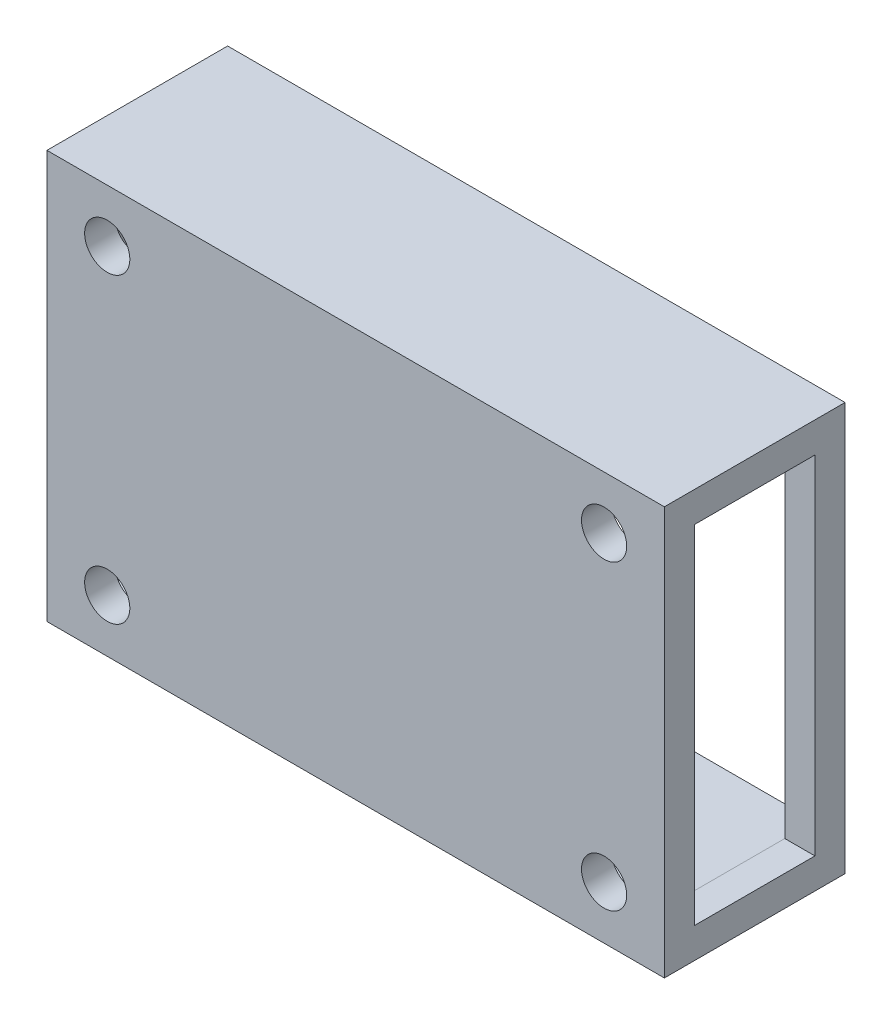
ISO-10303-21;
HEADER;
FILE_DESCRIPTION(('STEP AP214'),'2;1');
FILE_NAME('part.step','',(''),(''),'','','');
FILE_SCHEMA(('AUTOMOTIVE_DESIGN { 1 0 10303 214 1 1 1 1 }'));
ENDSEC;
DATA;
#1=APPLICATION_CONTEXT('core data for automotive mechanical design processes');
#2=APPLICATION_PROTOCOL_DEFINITION('international standard','automotive_design',2000,#1);
#3=PRODUCT_CONTEXT('',#1,'mechanical');
#4=PRODUCT('Part','Part','',(#3));
#5=PRODUCT_RELATED_PRODUCT_CATEGORY('part','',(#4));
#6=PRODUCT_DEFINITION_FORMATION('','',#4);
#7=PRODUCT_DEFINITION_CONTEXT('part definition',#1,'design');
#8=PRODUCT_DEFINITION('design','',#6,#7);
#9=PRODUCT_DEFINITION_SHAPE('','',#8);
#10=(LENGTH_UNIT() NAMED_UNIT(*) SI_UNIT(.MILLI.,.METRE.));
#11=(NAMED_UNIT(*) PLANE_ANGLE_UNIT() SI_UNIT($,.RADIAN.));
#12=(NAMED_UNIT(*) SI_UNIT($,.STERADIAN.) SOLID_ANGLE_UNIT());
#13=UNCERTAINTY_MEASURE_WITH_UNIT(LENGTH_MEASURE(1.E-05),#10,'distance_accuracy_value','');
#14=(GEOMETRIC_REPRESENTATION_CONTEXT(3) GLOBAL_UNCERTAINTY_ASSIGNED_CONTEXT((#13)) GLOBAL_UNIT_ASSIGNED_CONTEXT((#10,
#11,#12)) REPRESENTATION_CONTEXT('',''));
#15=CARTESIAN_POINT('',(0.,0.,0.));
#16=DIRECTION('',(0.,0.,1.));
#17=DIRECTION('',(1.,0.,0.));
#18=AXIS2_PLACEMENT_3D('',#15,#16,#17);
#19=CARTESIAN_POINT('',(2.,2.515,10.));
#20=DIRECTION('',(0.,0.,-1.));
#21=DIRECTION('',(-1.,0.,0.));
#22=AXIS2_PLACEMENT_3D('',#19,#20,#21);
#23=CYLINDRICAL_SURFACE('',#22,1.5);
#24=CARTESIAN_POINT('',(2.,2.515,2.));
#25=DIRECTION('',(0.,0.,-1.));
#26=DIRECTION('',(-1.,0.,0.));
#27=AXIS2_PLACEMENT_3D('',#24,#25,#26);
#28=CIRCLE('',#27,1.5);
#29=CARTESIAN_POINT('',(0.500000000000001,2.515,2.));
#30=VERTEX_POINT('',#29);
#31=EDGE_CURVE('E224',#30,#30,#28,.T.);
#32=ORIENTED_EDGE('',*,*,#31,.F.);
#33=EDGE_LOOP('',(#32));
#34=FACE_BOUND('',#33,.T.);
#35=CARTESIAN_POINT('',(2.,2.515,0.));
#36=DIRECTION('',(0.,0.,-1.));
#37=DIRECTION('',(-1.,0.,0.));
#38=AXIS2_PLACEMENT_3D('',#35,#36,#37);
#39=CIRCLE('',#38,1.5);
#40=CARTESIAN_POINT('',(2.,1.015,0.));
#41=VERTEX_POINT('',#40);
#42=EDGE_CURVE('E191',#41,#41,#39,.F.);
#43=ORIENTED_EDGE('',*,*,#42,.F.);
#44=EDGE_LOOP('',(#43));
#45=FACE_BOUND('',#44,.T.);
#46=ADVANCED_FACE('F34',(#34,#45),#23,.F.);
#47=CARTESIAN_POINT('',(2.,22.585,10.));
#48=DIRECTION('',(0.,0.,-1.));
#49=DIRECTION('',(-1.,0.,0.));
#50=AXIS2_PLACEMENT_3D('',#47,#48,#49);
#51=CYLINDRICAL_SURFACE('',#50,1.5);
#52=CARTESIAN_POINT('',(2.,22.585,2.));
#53=DIRECTION('',(0.,0.,-1.));
#54=DIRECTION('',(-1.,0.,0.));
#55=AXIS2_PLACEMENT_3D('',#52,#53,#54);
#56=CIRCLE('',#55,1.5);
#57=CARTESIAN_POINT('',(0.500000000000001,22.585,2.));
#58=VERTEX_POINT('',#57);
#59=EDGE_CURVE('E227',#58,#58,#56,.T.);
#60=ORIENTED_EDGE('',*,*,#59,.F.);
#61=EDGE_LOOP('',(#60));
#62=FACE_BOUND('',#61,.T.);
#63=CARTESIAN_POINT('',(2.,22.585,0.));
#64=DIRECTION('',(0.,0.,-1.));
#65=DIRECTION('',(-1.,0.,0.));
#66=AXIS2_PLACEMENT_3D('',#63,#64,#65);
#67=CIRCLE('',#66,1.5);
#68=CARTESIAN_POINT('',(2.,24.085,0.));
#69=VERTEX_POINT('',#68);
#70=EDGE_CURVE('E188',#69,#69,#67,.F.);
#71=ORIENTED_EDGE('',*,*,#70,.F.);
#72=EDGE_LOOP('',(#71));
#73=FACE_BOUND('',#72,.T.);
#74=ADVANCED_FACE('F268',(#62,#73),#51,.F.);
#75=CARTESIAN_POINT('',(34.9971426810003,2.515,5.));
#76=DIRECTION('',(0.,0.,-1.));
#77=DIRECTION('',(-1.,0.,0.));
#78=AXIS2_PLACEMENT_3D('',#75,#76,#77);
#79=CYLINDRICAL_SURFACE('',#78,1.5);
#80=CARTESIAN_POINT('',(34.9971426810003,2.515,2.));
#81=DIRECTION('',(0.,0.,-1.));
#82=DIRECTION('',(-1.,0.,0.));
#83=AXIS2_PLACEMENT_3D('',#80,#81,#82);
#84=CIRCLE('',#83,1.5);
#85=CARTESIAN_POINT('',(33.4971426810003,2.515,2.));
#86=VERTEX_POINT('',#85);
#87=EDGE_CURVE('E216',#86,#86,#84,.T.);
#88=ORIENTED_EDGE('',*,*,#87,.F.);
#89=EDGE_LOOP('',(#88));
#90=FACE_BOUND('',#89,.T.);
#91=CARTESIAN_POINT('',(34.9971426810003,2.515,0.));
#92=DIRECTION('',(0.,0.,-1.));
#93=DIRECTION('',(-1.,0.,0.));
#94=AXIS2_PLACEMENT_3D('',#91,#92,#93);
#95=CIRCLE('',#94,1.5);
#96=CARTESIAN_POINT('',(34.9971426810003,1.015,0.));
#97=VERTEX_POINT('',#96);
#98=EDGE_CURVE('E178',#97,#97,#95,.F.);
#99=ORIENTED_EDGE('',*,*,#98,.F.);
#100=EDGE_LOOP('',(#99));
#101=FACE_BOUND('',#100,.T.);
#102=ADVANCED_FACE('F265',(#90,#101),#79,.F.);
#103=CARTESIAN_POINT('',(34.9971426810003,22.585,5.));
#104=DIRECTION('',(0.,0.,-1.));
#105=DIRECTION('',(-1.,0.,0.));
#106=AXIS2_PLACEMENT_3D('',#103,#104,#105);
#107=CYLINDRICAL_SURFACE('',#106,1.5);
#108=CARTESIAN_POINT('',(34.9971426810003,22.585,2.));
#109=DIRECTION('',(0.,0.,-1.));
#110=DIRECTION('',(-1.,0.,0.));
#111=AXIS2_PLACEMENT_3D('',#108,#109,#110);
#112=CIRCLE('',#111,1.5);
#113=CARTESIAN_POINT('',(33.4971426810003,22.585,2.));
#114=VERTEX_POINT('',#113);
#115=EDGE_CURVE('E221',#114,#114,#112,.T.);
#116=ORIENTED_EDGE('',*,*,#115,.F.);
#117=EDGE_LOOP('',(#116));
#118=FACE_BOUND('',#117,.T.);
#119=CARTESIAN_POINT('',(34.9971426810003,22.585,0.));
#120=DIRECTION('',(0.,0.,-1.));
#121=DIRECTION('',(-1.,0.,0.));
#122=AXIS2_PLACEMENT_3D('',#119,#120,#121);
#123=CIRCLE('',#122,1.5);
#124=CARTESIAN_POINT('',(34.9971426810003,24.085,0.));
#125=VERTEX_POINT('',#124);
#126=EDGE_CURVE('E248',#125,#125,#123,.F.);
#127=ORIENTED_EDGE('',*,*,#126,.F.);
#128=EDGE_LOOP('',(#127));
#129=FACE_BOUND('',#128,.T.);
#130=ADVANCED_FACE('F267',(#118,#129),#107,.F.);
#131=CARTESIAN_POINT('',(0.,0.,2.));
#132=DIRECTION('',(0.,0.,-1.));
#133=DIRECTION('',(-1.,0.,0.));
#134=AXIS2_PLACEMENT_3D('',#131,#132,#133);
#135=PLANE('',#134);
#136=ORIENTED_EDGE('',*,*,#115,.T.);
#137=EDGE_LOOP('',(#136));
#138=FACE_BOUND('',#137,.T.);
#139=ORIENTED_EDGE('',*,*,#87,.T.);
#140=EDGE_LOOP('',(#139));
#141=FACE_BOUND('',#140,.T.);
#142=ORIENTED_EDGE('',*,*,#59,.T.);
#143=EDGE_LOOP('',(#142));
#144=FACE_BOUND('',#143,.T.);
#145=ORIENTED_EDGE('',*,*,#31,.T.);
#146=EDGE_LOOP('',(#145));
#147=FACE_BOUND('',#146,.T.);
#148=DIRECTION('',(0.,1.,0.));
#149=VECTOR('',#148,1.);
#150=CARTESIAN_POINT('',(39.,25.1,2.));
#151=LINE('',#150,#149);
#152=CARTESIAN_POINT('',(39.,-1.,2.));
#153=VERTEX_POINT('',#152);
#154=CARTESIAN_POINT('',(39.,26.1,2.));
#155=VERTEX_POINT('',#154);
#156=EDGE_CURVE('E244',#153,#155,#151,.T.);
#157=ORIENTED_EDGE('',*,*,#156,.T.);
#158=DIRECTION('',(1.,0.,0.));
#159=VECTOR('',#158,1.);
#160=CARTESIAN_POINT('',(39.,26.1,2.));
#161=LINE('',#160,#159);
#162=CARTESIAN_POINT('',(-2.00285731899973,26.1,2.));
#163=VERTEX_POINT('',#162);
#164=EDGE_CURVE('E207',#163,#155,#161,.T.);
#165=ORIENTED_EDGE('',*,*,#164,.F.);
#166=DIRECTION('',(0.,-1.,0.));
#167=VECTOR('',#166,1.);
#168=CARTESIAN_POINT('',(-2.00285731899973,25.1,2.));
#169=LINE('',#168,#167);
#170=CARTESIAN_POINT('',(-2.00285731899973,-1.,2.));
#171=VERTEX_POINT('',#170);
#172=EDGE_CURVE('E246',#163,#171,#169,.T.);
#173=ORIENTED_EDGE('',*,*,#172,.T.);
#174=DIRECTION('',(-1.,0.,0.));
#175=VECTOR('',#174,1.);
#176=CARTESIAN_POINT('',(-2.00285731899973,-1.,2.));
#177=LINE('',#176,#175);
#178=EDGE_CURVE('E195',#153,#171,#177,.T.);
#179=ORIENTED_EDGE('',*,*,#178,.F.);
#180=EDGE_LOOP('',(#157,#165,#173,#179));
#181=FACE_BOUND('',#180,.T.);
#182=ADVANCED_FACE('F275',(#138,#141,#144,#147,#181),#135,.F.);
#183=CARTESIAN_POINT('',(0.,0.,0.));
#184=DIRECTION('',(0.,0.,-1.));
#185=DIRECTION('',(-1.,0.,0.));
#186=AXIS2_PLACEMENT_3D('',#183,#184,#185);
#187=PLANE('',#186);
#188=ORIENTED_EDGE('',*,*,#126,.T.);
#189=DIRECTION('',(1.,0.,0.));
#190=VECTOR('',#189,1.);
#191=CARTESIAN_POINT('',(2.,24.085,0.));
#192=LINE('',#191,#190);
#193=CARTESIAN_POINT('',(36.9971426810003,24.085,0.));
#194=VERTEX_POINT('',#193);
#195=EDGE_CURVE('E166',#125,#194,#192,.T.);
#196=ORIENTED_EDGE('',*,*,#195,.T.);
#197=DIRECTION('',(0.,-1.,0.));
#198=VECTOR('',#197,1.);
#199=CARTESIAN_POINT('',(36.9971426810003,22.1,0.));
#200=LINE('',#199,#198);
#201=CARTESIAN_POINT('',(36.9971426810003,24.08,0.));
#202=VERTEX_POINT('',#201);
#203=EDGE_CURVE('E234',#194,#202,#200,.T.);
#204=ORIENTED_EDGE('',*,*,#203,.T.);
#205=DIRECTION('',(1.,0.,0.));
#206=VECTOR('',#205,1.);
#207=CARTESIAN_POINT('',(29.,24.08,0.));
#208=LINE('',#207,#206);
#209=CARTESIAN_POINT('',(39.,24.08,0.));
#210=VERTEX_POINT('',#209);
#211=EDGE_CURVE('E157',#202,#210,#208,.T.);
#212=ORIENTED_EDGE('',*,*,#211,.T.);
#213=DIRECTION('',(0.,-1.,0.));
#214=VECTOR('',#213,1.);
#215=CARTESIAN_POINT('',(39.,1.02,0.));
#216=LINE('',#215,#214);
#217=CARTESIAN_POINT('',(39.,1.02,0.));
#218=VERTEX_POINT('',#217);
#219=EDGE_CURVE('E49',#210,#218,#216,.T.);
#220=ORIENTED_EDGE('',*,*,#219,.T.);
#221=DIRECTION('',(1.,0.,0.));
#222=VECTOR('',#221,1.);
#223=CARTESIAN_POINT('',(29.,1.02,0.));
#224=LINE('',#223,#222);
#225=CARTESIAN_POINT('',(36.9971426810003,1.02,0.));
#226=VERTEX_POINT('',#225);
#227=EDGE_CURVE('E142',#226,#218,#224,.T.);
#228=ORIENTED_EDGE('',*,*,#227,.F.);
#229=CARTESIAN_POINT('',(36.9971426810003,1.015,0.));
#230=VERTEX_POINT('',#229);
#231=EDGE_CURVE('E238',#226,#230,#200,.T.);
#232=ORIENTED_EDGE('',*,*,#231,.T.);
#233=DIRECTION('',(-1.,0.,0.));
#234=VECTOR('',#233,1.);
#235=CARTESIAN_POINT('',(36.9971426810003,1.015,0.));
#236=LINE('',#235,#234);
#237=EDGE_CURVE('E167',#230,#97,#236,.T.);
#238=ORIENTED_EDGE('',*,*,#237,.T.);
#239=ORIENTED_EDGE('',*,*,#98,.T.);
#240=EDGE_CURVE('E171',#97,#41,#236,.T.);
#241=ORIENTED_EDGE('',*,*,#240,.T.);
#242=ORIENTED_EDGE('',*,*,#42,.T.);
#243=CARTESIAN_POINT('',(0.,1.015,0.));
#244=VERTEX_POINT('',#243);
#245=EDGE_CURVE('E164',#41,#244,#236,.T.);
#246=ORIENTED_EDGE('',*,*,#245,.T.);
#247=DIRECTION('',(0.,1.,0.));
#248=VECTOR('',#247,1.);
#249=CARTESIAN_POINT('',(0.,22.1,0.));
#250=LINE('',#249,#248);
#251=CARTESIAN_POINT('',(0.,24.085,0.));
#252=VERTEX_POINT('',#251);
#253=EDGE_CURVE('E230',#244,#252,#250,.T.);
#254=ORIENTED_EDGE('',*,*,#253,.T.);
#255=EDGE_CURVE('E162',#252,#69,#192,.T.);
#256=ORIENTED_EDGE('',*,*,#255,.T.);
#257=ORIENTED_EDGE('',*,*,#70,.T.);
#258=EDGE_CURVE('E165',#69,#125,#192,.T.);
#259=ORIENTED_EDGE('',*,*,#258,.T.);
#260=EDGE_LOOP('',(#188,#196,#204,#212,#220,#228,#232,#238,#239,#241,#242,#246,#254,#256,#257,#259));
#261=FACE_BOUND('',#260,.T.);
#262=ADVANCED_FACE('F36',(#261),#187,.T.);
#263=CARTESIAN_POINT('',(-2.00285731899973,25.1,0.));
#264=DIRECTION('',(-1.,0.,0.));
#265=DIRECTION('',(0.,0.,1.));
#266=AXIS2_PLACEMENT_3D('',#263,#264,#265);
#267=PLANE('',#266);
#268=ORIENTED_EDGE('',*,*,#172,.F.);
#269=DIRECTION('',(0.,0.,-1.));
#270=VECTOR('',#269,1.);
#271=CARTESIAN_POINT('',(-2.00285731899973,26.1,2.));
#272=LINE('',#271,#270);
#273=CARTESIAN_POINT('',(-2.00285731899973,26.1,-10.));
#274=VERTEX_POINT('',#273);
#275=EDGE_CURVE('E210',#163,#274,#272,.T.);
#276=ORIENTED_EDGE('',*,*,#275,.T.);
#277=DIRECTION('',(0.,1.,0.));
#278=VECTOR('',#277,1.);
#279=CARTESIAN_POINT('',(-2.00285731899973,25.1,-10.));
#280=LINE('',#279,#278);
#281=CARTESIAN_POINT('',(-2.00285731899973,-1.,-10.));
#282=VERTEX_POINT('',#281);
#283=EDGE_CURVE('E242',#282,#274,#280,.T.);
#284=ORIENTED_EDGE('',*,*,#283,.F.);
#285=DIRECTION('',(0.,0.,-1.));
#286=VECTOR('',#285,1.);
#287=CARTESIAN_POINT('',(-2.00285731899973,-1.,2.));
#288=LINE('',#287,#286);
#289=EDGE_CURVE('E201',#171,#282,#288,.T.);
#290=ORIENTED_EDGE('',*,*,#289,.F.);
#291=EDGE_LOOP('',(#268,#276,#284,#290));
#292=FACE_BOUND('',#291,.T.);
#293=ADVANCED_FACE('F304',(#292),#267,.T.);
#294=CARTESIAN_POINT('',(39.,25.1,0.));
#295=DIRECTION('',(1.,0.,0.));
#296=DIRECTION('',(0.,0.,-1.));
#297=AXIS2_PLACEMENT_3D('',#294,#295,#296);
#298=PLANE('',#297);
#299=ORIENTED_EDGE('',*,*,#219,.F.);
#300=DIRECTION('',(0.,0.,1.));
#301=VECTOR('',#300,1.);
#302=CARTESIAN_POINT('',(39.,24.08,-8.00000000000001));
#303=LINE('',#302,#301);
#304=CARTESIAN_POINT('',(39.,24.08,-8.00000000000001));
#305=VERTEX_POINT('',#304);
#306=EDGE_CURVE('E152',#305,#210,#303,.T.);
#307=ORIENTED_EDGE('',*,*,#306,.F.);
#308=DIRECTION('',(0.,1.,0.));
#309=VECTOR('',#308,1.);
#310=CARTESIAN_POINT('',(39.,24.08,-8.00000000000001));
#311=LINE('',#310,#309);
#312=CARTESIAN_POINT('',(39.,1.02,-8.00000000000001));
#313=VERTEX_POINT('',#312);
#314=EDGE_CURVE('E137',#313,#305,#311,.T.);
#315=ORIENTED_EDGE('',*,*,#314,.F.);
#316=DIRECTION('',(0.,0.,-1.));
#317=VECTOR('',#316,1.);
#318=CARTESIAN_POINT('',(39.,1.02,-8.00000000000001));
#319=LINE('',#318,#317);
#320=EDGE_CURVE('E145',#218,#313,#319,.T.);
#321=ORIENTED_EDGE('',*,*,#320,.F.);
#322=EDGE_LOOP('',(#299,#307,#315,#321));
#323=FACE_BOUND('',#322,.T.);
#324=ORIENTED_EDGE('',*,*,#156,.F.);
#325=DIRECTION('',(0.,0.,-1.));
#326=VECTOR('',#325,1.);
#327=CARTESIAN_POINT('',(39.,-1.,2.));
#328=LINE('',#327,#326);
#329=CARTESIAN_POINT('',(39.,-1.,-10.));
#330=VERTEX_POINT('',#329);
#331=EDGE_CURVE('E198',#153,#330,#328,.T.);
#332=ORIENTED_EDGE('',*,*,#331,.T.);
#333=DIRECTION('',(0.,-1.,0.));
#334=VECTOR('',#333,1.);
#335=CARTESIAN_POINT('',(39.,0.,-10.));
#336=LINE('',#335,#334);
#337=CARTESIAN_POINT('',(39.,26.1,-10.));
#338=VERTEX_POINT('',#337);
#339=EDGE_CURVE('E236',#338,#330,#336,.T.);
#340=ORIENTED_EDGE('',*,*,#339,.F.);
#341=DIRECTION('',(0.,0.,-1.));
#342=VECTOR('',#341,1.);
#343=CARTESIAN_POINT('',(39.,26.1,2.));
#344=LINE('',#343,#342);
#345=EDGE_CURVE('E213',#155,#338,#344,.T.);
#346=ORIENTED_EDGE('',*,*,#345,.F.);
#347=EDGE_LOOP('',(#324,#332,#340,#346));
#348=FACE_BOUND('',#347,.T.);
#349=ADVANCED_FACE('F149',(#323,#348),#298,.T.);
#350=CARTESIAN_POINT('',(36.9971426810003,22.1,-10.));
#351=DIRECTION('',(-1.,0.,0.));
#352=DIRECTION('',(0.,0.,1.));
#353=AXIS2_PLACEMENT_3D('',#350,#351,#352);
#354=PLANE('',#353);
#355=DIRECTION('',(0.,0.,-1.));
#356=VECTOR('',#355,1.);
#357=CARTESIAN_POINT('',(36.9971426810003,24.08,-10.));
#358=LINE('',#357,#356);
#359=CARTESIAN_POINT('',(36.9971426810003,24.08,-8.00000000000001));
#360=VERTEX_POINT('',#359);
#361=EDGE_CURVE('E11',#202,#360,#358,.T.);
#362=ORIENTED_EDGE('',*,*,#361,.F.);
#363=ORIENTED_EDGE('',*,*,#203,.F.);
#364=DIRECTION('',(0.,0.,-1.));
#365=VECTOR('',#364,1.);
#366=CARTESIAN_POINT('',(36.9971426810003,24.085,0.));
#367=LINE('',#366,#365);
#368=CARTESIAN_POINT('',(36.9971426810003,24.085,-10.));
#369=VERTEX_POINT('',#368);
#370=EDGE_CURVE('E170',#194,#369,#367,.T.);
#371=ORIENTED_EDGE('',*,*,#370,.T.);
#372=DIRECTION('',(0.,-1.,0.));
#373=VECTOR('',#372,1.);
#374=CARTESIAN_POINT('',(36.9971426810003,22.1,-10.));
#375=LINE('',#374,#373);
#376=CARTESIAN_POINT('',(36.9971426810003,1.015,-10.));
#377=VERTEX_POINT('',#376);
#378=EDGE_CURVE('E233',#369,#377,#375,.T.);
#379=ORIENTED_EDGE('',*,*,#378,.T.);
#380=DIRECTION('',(0.,0.,-1.));
#381=VECTOR('',#380,1.);
#382=CARTESIAN_POINT('',(36.9971426810003,1.015,0.));
#383=LINE('',#382,#381);
#384=EDGE_CURVE('E182',#230,#377,#383,.T.);
#385=ORIENTED_EDGE('',*,*,#384,.F.);
#386=ORIENTED_EDGE('',*,*,#231,.F.);
#387=DIRECTION('',(0.,0.,1.));
#388=VECTOR('',#387,1.);
#389=CARTESIAN_POINT('',(36.9971426810003,1.02,-9.99999999999999));
#390=LINE('',#389,#388);
#391=CARTESIAN_POINT('',(36.9971426810003,1.02,-8.00000000000001));
#392=VERTEX_POINT('',#391);
#393=EDGE_CURVE('E250',#392,#226,#390,.T.);
#394=ORIENTED_EDGE('',*,*,#393,.F.);
#395=DIRECTION('',(0.,-1.,0.));
#396=VECTOR('',#395,1.);
#397=CARTESIAN_POINT('',(36.9971426810003,22.1,-8.00000000000001));
#398=LINE('',#397,#396);
#399=EDGE_CURVE('E42',#360,#392,#398,.T.);
#400=ORIENTED_EDGE('',*,*,#399,.F.);
#401=EDGE_LOOP('',(#362,#363,#371,#379,#385,#386,#394,#400));
#402=FACE_BOUND('',#401,.T.);
#403=ADVANCED_FACE('F255',(#402),#354,.T.);
#404=CARTESIAN_POINT('',(0.,22.1,-10.));
#405=DIRECTION('',(1.,0.,0.));
#406=DIRECTION('',(0.,0.,-1.));
#407=AXIS2_PLACEMENT_3D('',#404,#405,#406);
#408=PLANE('',#407);
#409=ORIENTED_EDGE('',*,*,#253,.F.);
#410=DIRECTION('',(0.,0.,-1.));
#411=VECTOR('',#410,1.);
#412=CARTESIAN_POINT('',(0.,1.015,0.));
#413=LINE('',#412,#411);
#414=CARTESIAN_POINT('',(0.,1.015,-10.));
#415=VERTEX_POINT('',#414);
#416=EDGE_CURVE('E179',#244,#415,#413,.T.);
#417=ORIENTED_EDGE('',*,*,#416,.T.);
#418=DIRECTION('',(0.,1.,0.));
#419=VECTOR('',#418,1.);
#420=CARTESIAN_POINT('',(0.,22.1,-10.));
#421=LINE('',#420,#419);
#422=CARTESIAN_POINT('',(0.,24.085,-10.));
#423=VERTEX_POINT('',#422);
#424=EDGE_CURVE('E231',#415,#423,#421,.T.);
#425=ORIENTED_EDGE('',*,*,#424,.T.);
#426=DIRECTION('',(0.,0.,-1.));
#427=VECTOR('',#426,1.);
#428=CARTESIAN_POINT('',(0.,24.085,0.));
#429=LINE('',#428,#427);
#430=EDGE_CURVE('E175',#252,#423,#429,.T.);
#431=ORIENTED_EDGE('',*,*,#430,.F.);
#432=EDGE_LOOP('',(#409,#417,#425,#431));
#433=FACE_BOUND('',#432,.T.);
#434=ADVANCED_FACE('F293',(#433),#408,.T.);
#435=CARTESIAN_POINT('',(0.,0.,-10.));
#436=DIRECTION('',(0.,0.,1.));
#437=DIRECTION('',(1.,0.,0.));
#438=AXIS2_PLACEMENT_3D('',#435,#436,#437);
#439=PLANE('',#438);
#440=ORIENTED_EDGE('',*,*,#424,.F.);
#441=DIRECTION('',(-1.,0.,0.));
#442=VECTOR('',#441,1.);
#443=CARTESIAN_POINT('',(2.,1.015,-10.));
#444=LINE('',#443,#442);
#445=EDGE_CURVE('E159',#377,#415,#444,.T.);
#446=ORIENTED_EDGE('',*,*,#445,.F.);
#447=ORIENTED_EDGE('',*,*,#378,.F.);
#448=DIRECTION('',(1.,0.,0.));
#449=VECTOR('',#448,1.);
#450=CARTESIAN_POINT('',(2.,24.085,-10.));
#451=LINE('',#450,#449);
#452=EDGE_CURVE('E173',#423,#369,#451,.T.);
#453=ORIENTED_EDGE('',*,*,#452,.F.);
#454=EDGE_LOOP('',(#440,#446,#447,#453));
#455=FACE_BOUND('',#454,.T.);
#456=ORIENTED_EDGE('',*,*,#339,.T.);
#457=DIRECTION('',(-1.,0.,0.));
#458=VECTOR('',#457,1.);
#459=CARTESIAN_POINT('',(-2.00285731899973,-1.,-10.));
#460=LINE('',#459,#458);
#461=EDGE_CURVE('E194',#330,#282,#460,.T.);
#462=ORIENTED_EDGE('',*,*,#461,.T.);
#463=ORIENTED_EDGE('',*,*,#283,.T.);
#464=DIRECTION('',(1.,0.,0.));
#465=VECTOR('',#464,1.);
#466=CARTESIAN_POINT('',(39.,26.1,-10.));
#467=LINE('',#466,#465);
#468=EDGE_CURVE('E204',#274,#338,#467,.T.);
#469=ORIENTED_EDGE('',*,*,#468,.T.);
#470=EDGE_LOOP('',(#456,#462,#463,#469));
#471=FACE_BOUND('',#470,.T.);
#472=ADVANCED_FACE('F296',(#455,#471),#439,.F.);
#473=CARTESIAN_POINT('',(39.,26.1,2.));
#474=DIRECTION('',(0.,1.,0.));
#475=DIRECTION('',(0.,0.,1.));
#476=AXIS2_PLACEMENT_3D('',#473,#474,#475);
#477=PLANE('',#476);
#478=ORIENTED_EDGE('',*,*,#468,.F.);
#479=ORIENTED_EDGE('',*,*,#275,.F.);
#480=ORIENTED_EDGE('',*,*,#164,.T.);
#481=ORIENTED_EDGE('',*,*,#345,.T.);
#482=EDGE_LOOP('',(#478,#479,#480,#481));
#483=FACE_BOUND('',#482,.T.);
#484=ADVANCED_FACE('F300',(#483),#477,.T.);
#485=CARTESIAN_POINT('',(-2.00285731899973,-1.,2.));
#486=DIRECTION('',(0.,-1.,0.));
#487=DIRECTION('',(0.,0.,-1.));
#488=AXIS2_PLACEMENT_3D('',#485,#486,#487);
#489=PLANE('',#488);
#490=ORIENTED_EDGE('',*,*,#461,.F.);
#491=ORIENTED_EDGE('',*,*,#331,.F.);
#492=ORIENTED_EDGE('',*,*,#178,.T.);
#493=ORIENTED_EDGE('',*,*,#289,.T.);
#494=EDGE_LOOP('',(#490,#491,#492,#493));
#495=FACE_BOUND('',#494,.T.);
#496=ADVANCED_FACE('F329',(#495),#489,.T.);
#497=CARTESIAN_POINT('',(2.,24.085,0.));
#498=DIRECTION('',(0.,1.,0.));
#499=DIRECTION('',(0.,0.,1.));
#500=AXIS2_PLACEMENT_3D('',#497,#498,#499);
#501=PLANE('',#500);
#502=ORIENTED_EDGE('',*,*,#452,.T.);
#503=ORIENTED_EDGE('',*,*,#370,.F.);
#504=ORIENTED_EDGE('',*,*,#195,.F.);
#505=ORIENTED_EDGE('',*,*,#258,.F.);
#506=ORIENTED_EDGE('',*,*,#255,.F.);
#507=ORIENTED_EDGE('',*,*,#430,.T.);
#508=EDGE_LOOP('',(#502,#503,#504,#505,#506,#507));
#509=FACE_BOUND('',#508,.T.);
#510=ADVANCED_FACE('F332',(#509),#501,.F.);
#511=CARTESIAN_POINT('',(2.,1.015,0.));
#512=DIRECTION('',(0.,-1.,0.));
#513=DIRECTION('',(0.,0.,-1.));
#514=AXIS2_PLACEMENT_3D('',#511,#512,#513);
#515=PLANE('',#514);
#516=ORIENTED_EDGE('',*,*,#445,.T.);
#517=ORIENTED_EDGE('',*,*,#416,.F.);
#518=ORIENTED_EDGE('',*,*,#245,.F.);
#519=ORIENTED_EDGE('',*,*,#240,.F.);
#520=ORIENTED_EDGE('',*,*,#237,.F.);
#521=ORIENTED_EDGE('',*,*,#384,.T.);
#522=EDGE_LOOP('',(#516,#517,#518,#519,#520,#521));
#523=FACE_BOUND('',#522,.T.);
#524=ADVANCED_FACE('F261',(#523),#515,.F.);
#525=CARTESIAN_POINT('',(29.,24.08,-8.00000000000001));
#526=DIRECTION('',(0.,1.,0.));
#527=DIRECTION('',(0.,0.,1.));
#528=AXIS2_PLACEMENT_3D('',#525,#526,#527);
#529=PLANE('',#528);
#530=ORIENTED_EDGE('',*,*,#361,.T.);
#531=DIRECTION('',(1.,0.,0.));
#532=VECTOR('',#531,1.);
#533=CARTESIAN_POINT('',(29.,24.08,-8.00000000000001));
#534=LINE('',#533,#532);
#535=EDGE_CURVE('E141',#360,#305,#534,.T.);
#536=ORIENTED_EDGE('',*,*,#535,.T.);
#537=ORIENTED_EDGE('',*,*,#306,.T.);
#538=ORIENTED_EDGE('',*,*,#211,.F.);
#539=EDGE_LOOP('',(#530,#536,#537,#538));
#540=FACE_BOUND('',#539,.T.);
#541=ADVANCED_FACE('F342',(#540),#529,.F.);
#542=CARTESIAN_POINT('',(29.,24.08,-8.00000000000001));
#543=DIRECTION('',(0.,0.,-1.));
#544=DIRECTION('',(-1.,0.,0.));
#545=AXIS2_PLACEMENT_3D('',#542,#543,#544);
#546=PLANE('',#545);
#547=ORIENTED_EDGE('',*,*,#399,.T.);
#548=DIRECTION('',(1.,0.,0.));
#549=VECTOR('',#548,1.);
#550=CARTESIAN_POINT('',(29.,1.02,-8.00000000000001));
#551=LINE('',#550,#549);
#552=EDGE_CURVE('E57',#392,#313,#551,.T.);
#553=ORIENTED_EDGE('',*,*,#552,.T.);
#554=ORIENTED_EDGE('',*,*,#314,.T.);
#555=ORIENTED_EDGE('',*,*,#535,.F.);
#556=EDGE_LOOP('',(#547,#553,#554,#555));
#557=FACE_BOUND('',#556,.T.);
#558=ADVANCED_FACE('F134',(#557),#546,.F.);
#559=CARTESIAN_POINT('',(29.,1.02,-8.00000000000001));
#560=DIRECTION('',(0.,-1.,0.));
#561=DIRECTION('',(0.,0.,-1.));
#562=AXIS2_PLACEMENT_3D('',#559,#560,#561);
#563=PLANE('',#562);
#564=ORIENTED_EDGE('',*,*,#393,.T.);
#565=ORIENTED_EDGE('',*,*,#227,.T.);
#566=ORIENTED_EDGE('',*,*,#320,.T.);
#567=ORIENTED_EDGE('',*,*,#552,.F.);
#568=EDGE_LOOP('',(#564,#565,#566,#567));
#569=FACE_BOUND('',#568,.T.);
#570=ADVANCED_FACE('F146',(#569),#563,.F.);
#571=CLOSED_SHELL('',(#46,#74,#102,#130,#182,#262,#293,#349,#403,#434,#472,#484,#496,#510,#524,
#541,#558,#570));
#572=MANIFOLD_SOLID_BREP('B2',#571);
#573=ADVANCED_BREP_SHAPE_REPRESENTATION('',(#18,#572),#14);
#574=SHAPE_DEFINITION_REPRESENTATION(#9,#573);
ENDSEC;
END-ISO-10303-21;
